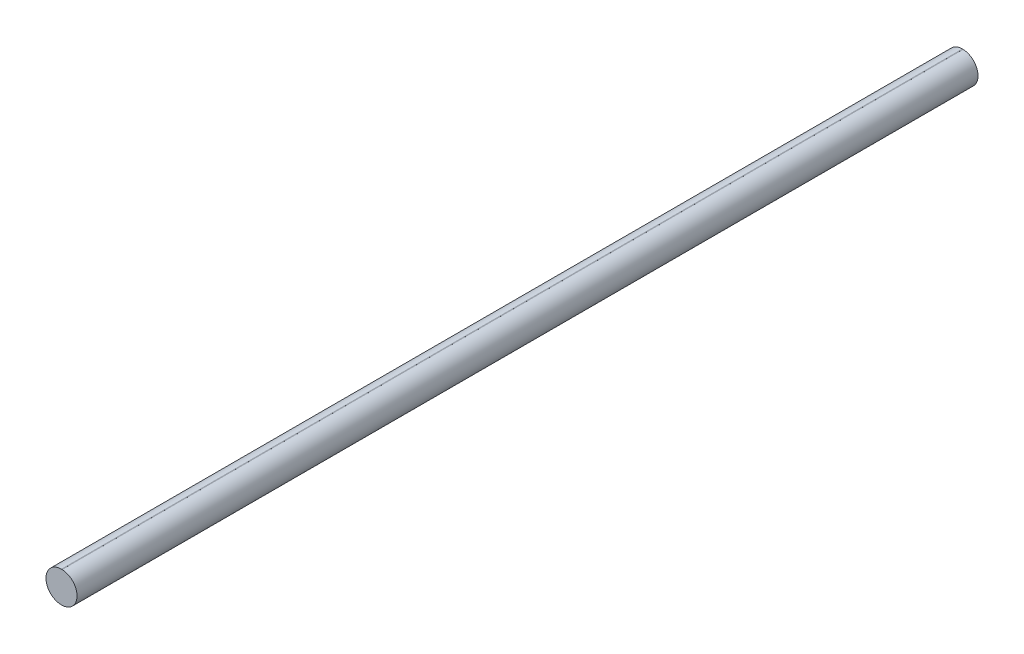
ISO-10303-21;
HEADER;
FILE_DESCRIPTION(('STEP AP214'),'2;1');
FILE_NAME('part.step','',(''),(''),'','','');
FILE_SCHEMA(('AUTOMOTIVE_DESIGN { 1 0 10303 214 1 1 1 1 }'));
ENDSEC;
DATA;
#1=APPLICATION_CONTEXT('core data for automotive mechanical design processes');
#2=APPLICATION_PROTOCOL_DEFINITION('international standard','automotive_design',2000,#1);
#3=PRODUCT_CONTEXT('',#1,'mechanical');
#4=PRODUCT('Part','Part','',(#3));
#5=PRODUCT_RELATED_PRODUCT_CATEGORY('part','',(#4));
#6=PRODUCT_DEFINITION_FORMATION('','',#4);
#7=PRODUCT_DEFINITION_CONTEXT('part definition',#1,'design');
#8=PRODUCT_DEFINITION('design','',#6,#7);
#9=PRODUCT_DEFINITION_SHAPE('','',#8);
#10=(LENGTH_UNIT() NAMED_UNIT(*) SI_UNIT(.MILLI.,.METRE.));
#11=(NAMED_UNIT(*) PLANE_ANGLE_UNIT() SI_UNIT($,.RADIAN.));
#12=(NAMED_UNIT(*) SI_UNIT($,.STERADIAN.) SOLID_ANGLE_UNIT());
#13=UNCERTAINTY_MEASURE_WITH_UNIT(LENGTH_MEASURE(1.E-05),#10,'distance_accuracy_value','');
#14=(GEOMETRIC_REPRESENTATION_CONTEXT(3) GLOBAL_UNCERTAINTY_ASSIGNED_CONTEXT((#13)) GLOBAL_UNIT_ASSIGNED_CONTEXT((#10,
#11,#12)) REPRESENTATION_CONTEXT('',''));
#15=CARTESIAN_POINT('',(0.,0.,0.));
#16=DIRECTION('',(0.,0.,1.));
#17=DIRECTION('',(1.,0.,0.));
#18=AXIS2_PLACEMENT_3D('',#15,#16,#17);
#19=CARTESIAN_POINT('',(0.,0.,184.15));
#20=DIRECTION('',(0.,0.,-1.));
#21=DIRECTION('',(-1.,0.,0.));
#22=AXIS2_PLACEMENT_3D('',#19,#20,#21);
#23=CYLINDRICAL_SURFACE('',#22,3.175);
#24=CARTESIAN_POINT('',(0.,0.,0.));
#25=DIRECTION('',(0.,0.,1.));
#26=DIRECTION('',(1.,0.,0.));
#27=AXIS2_PLACEMENT_3D('',#24,#25,#26);
#28=CIRCLE('',#27,3.175);
#29=CARTESIAN_POINT('',(0.,3.175,0.));
#30=VERTEX_POINT('',#29);
#31=CARTESIAN_POINT('',(0.123608439386968,3.17259293854606,0.));
#32=VERTEX_POINT('',#31);
#33=EDGE_CURVE('E44',#30,#32,#28,.T.);
#34=ORIENTED_EDGE('',*,*,#33,.T.);
#35=DIRECTION('',(0.,0.,-1.));
#36=VECTOR('',#35,1.);
#37=CARTESIAN_POINT('',(0.123608439386968,3.17259293854606,184.15));
#38=LINE('',#37,#36);
#39=CARTESIAN_POINT('',(0.123608439386968,3.17259293854606,184.15));
#40=VERTEX_POINT('',#39);
#41=EDGE_CURVE('E80',#32,#40,#38,.F.);
#42=ORIENTED_EDGE('',*,*,#41,.T.);
#43=CARTESIAN_POINT('',(0.,0.,184.15));
#44=DIRECTION('',(0.,0.,1.));
#45=DIRECTION('',(1.,0.,0.));
#46=AXIS2_PLACEMENT_3D('',#43,#44,#45);
#47=CIRCLE('',#46,3.175);
#48=CARTESIAN_POINT('',(0.,3.175,184.15));
#49=VERTEX_POINT('',#48);
#50=EDGE_CURVE('E11',#49,#40,#47,.T.);
#51=ORIENTED_EDGE('',*,*,#50,.F.);
#52=DIRECTION('',(0.,0.,1.));
#53=VECTOR('',#52,1.);
#54=CARTESIAN_POINT('',(0.,3.175,0.));
#55=LINE('',#54,#53);
#56=EDGE_CURVE('E87',#30,#49,#55,.T.);
#57=ORIENTED_EDGE('',*,*,#56,.F.);
#58=EDGE_LOOP('',(#34,#42,#51,#57));
#59=FACE_BOUND('',#58,.T.);
#60=ADVANCED_FACE('F41',(#59),#23,.T.);
#61=CARTESIAN_POINT('',(0.,0.,184.15));
#62=DIRECTION('',(0.,0.,1.));
#63=DIRECTION('',(1.,0.,0.));
#64=AXIS2_PLACEMENT_3D('',#61,#62,#63);
#65=PLANE('',#64);
#66=ORIENTED_EDGE('',*,*,#50,.T.);
#67=DIRECTION('',(0.,1.,0.));
#68=VECTOR('',#67,1.);
#69=CARTESIAN_POINT('',(0.123608439386968,3.175,184.15));
#70=LINE('',#69,#68);
#71=CARTESIAN_POINT('',(0.123608439386968,3.175,184.15));
#72=VERTEX_POINT('',#71);
#73=EDGE_CURVE('E92',#40,#72,#70,.T.);
#74=ORIENTED_EDGE('',*,*,#73,.T.);
#75=DIRECTION('',(-1.,0.,0.));
#76=VECTOR('',#75,1.);
#77=CARTESIAN_POINT('',(0.,3.175,184.15));
#78=LINE('',#77,#76);
#79=EDGE_CURVE('E54',#72,#49,#78,.T.);
#80=ORIENTED_EDGE('',*,*,#79,.T.);
#81=EDGE_LOOP('',(#66,#74,#80));
#82=FACE_BOUND('',#81,.T.);
#83=ADVANCED_FACE('F97',(#82),#65,.T.);
#84=CARTESIAN_POINT('',(0.,0.,0.));
#85=DIRECTION('',(0.,0.,1.));
#86=DIRECTION('',(1.,0.,0.));
#87=AXIS2_PLACEMENT_3D('',#84,#85,#86);
#88=PLANE('',#87);
#89=DIRECTION('',(0.,1.,0.));
#90=VECTOR('',#89,1.);
#91=CARTESIAN_POINT('',(0.123608439386968,3.175,0.));
#92=LINE('',#91,#90);
#93=CARTESIAN_POINT('',(0.123608439386968,3.175,0.));
#94=VERTEX_POINT('',#93);
#95=EDGE_CURVE('E75',#32,#94,#92,.T.);
#96=ORIENTED_EDGE('',*,*,#95,.F.);
#97=ORIENTED_EDGE('',*,*,#33,.F.);
#98=DIRECTION('',(-1.,0.,0.));
#99=VECTOR('',#98,1.);
#100=CARTESIAN_POINT('',(0.,3.175,0.));
#101=LINE('',#100,#99);
#102=EDGE_CURVE('E83',#94,#30,#101,.T.);
#103=ORIENTED_EDGE('',*,*,#102,.F.);
#104=EDGE_LOOP('',(#96,#97,#103));
#105=FACE_BOUND('',#104,.T.);
#106=ADVANCED_FACE('F89',(#105),#88,.F.);
#107=CARTESIAN_POINT('',(0.123608439386968,3.175,0.));
#108=DIRECTION('',(1.,0.,0.));
#109=DIRECTION('',(0.,0.,-1.));
#110=AXIS2_PLACEMENT_3D('',#107,#108,#109);
#111=PLANE('',#110);
#112=ORIENTED_EDGE('',*,*,#41,.F.);
#113=ORIENTED_EDGE('',*,*,#95,.T.);
#114=DIRECTION('',(0.,0.,1.));
#115=VECTOR('',#114,1.);
#116=CARTESIAN_POINT('',(0.123608439386968,3.175,0.));
#117=LINE('',#116,#115);
#118=EDGE_CURVE('E79',#94,#72,#117,.T.);
#119=ORIENTED_EDGE('',*,*,#118,.T.);
#120=ORIENTED_EDGE('',*,*,#73,.F.);
#121=EDGE_LOOP('',(#112,#113,#119,#120));
#122=FACE_BOUND('',#121,.T.);
#123=ADVANCED_FACE('F77',(#122),#111,.T.);
#124=CARTESIAN_POINT('',(0.,3.175,0.));
#125=DIRECTION('',(0.,1.,0.));
#126=DIRECTION('',(0.,0.,1.));
#127=AXIS2_PLACEMENT_3D('',#124,#125,#126);
#128=PLANE('',#127);
#129=ORIENTED_EDGE('',*,*,#79,.F.);
#130=ORIENTED_EDGE('',*,*,#118,.F.);
#131=ORIENTED_EDGE('',*,*,#102,.T.);
#132=ORIENTED_EDGE('',*,*,#56,.T.);
#133=EDGE_LOOP('',(#129,#130,#131,#132));
#134=FACE_BOUND('',#133,.T.);
#135=ADVANCED_FACE('F86',(#134),#128,.T.);
#136=CLOSED_SHELL('',(#60,#83,#106,#123,#135));
#137=MANIFOLD_SOLID_BREP('B2',#136);
#138=ADVANCED_BREP_SHAPE_REPRESENTATION('',(#18,#137),#14);
#139=SHAPE_DEFINITION_REPRESENTATION(#9,#138);
ENDSEC;
END-ISO-10303-21;
